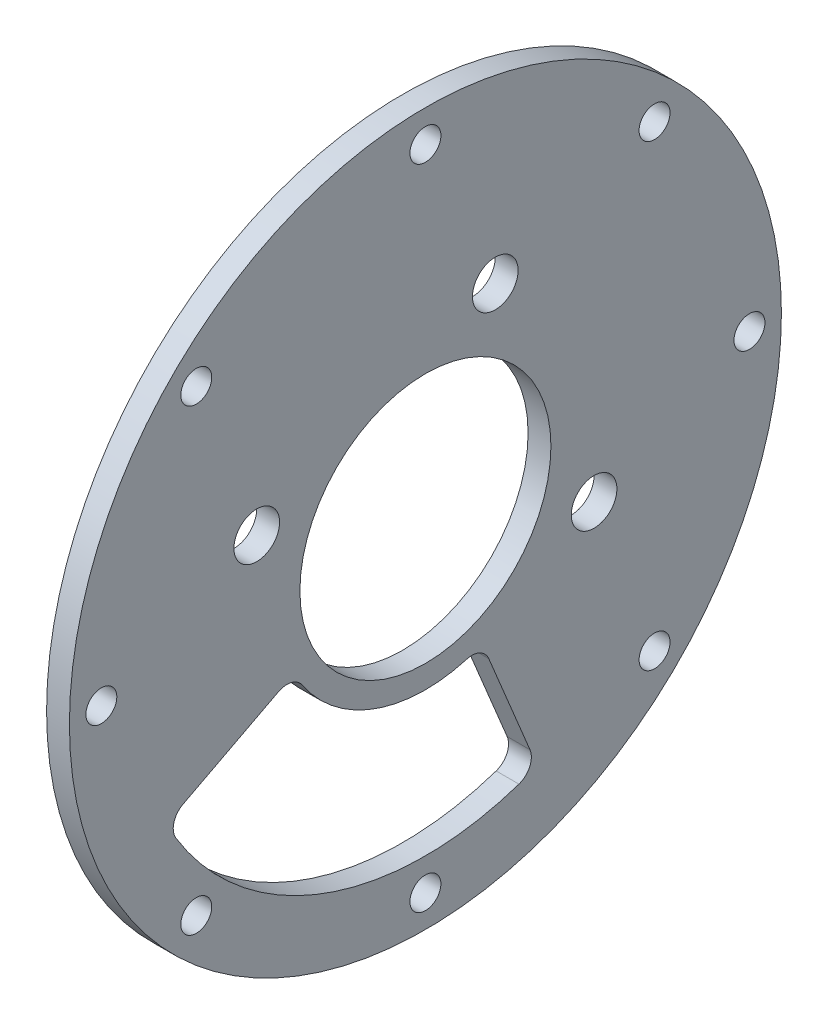
ISO-10303-21;
HEADER;
FILE_DESCRIPTION(('STEP AP214'),'2;1');
FILE_NAME('part.step','',(''),(''),'','','');
FILE_SCHEMA(('AUTOMOTIVE_DESIGN { 1 0 10303 214 1 1 1 1 }'));
ENDSEC;
DATA;
#1=APPLICATION_CONTEXT('core data for automotive mechanical design processes');
#2=APPLICATION_PROTOCOL_DEFINITION('international standard','automotive_design',2000,#1);
#3=PRODUCT_CONTEXT('',#1,'mechanical');
#4=PRODUCT('Part','Part','',(#3));
#5=PRODUCT_RELATED_PRODUCT_CATEGORY('part','',(#4));
#6=PRODUCT_DEFINITION_FORMATION('','',#4);
#7=PRODUCT_DEFINITION_CONTEXT('part definition',#1,'design');
#8=PRODUCT_DEFINITION('design','',#6,#7);
#9=PRODUCT_DEFINITION_SHAPE('','',#8);
#10=(LENGTH_UNIT() NAMED_UNIT(*) SI_UNIT(.MILLI.,.METRE.));
#11=(NAMED_UNIT(*) PLANE_ANGLE_UNIT() SI_UNIT($,.RADIAN.));
#12=(NAMED_UNIT(*) SI_UNIT($,.STERADIAN.) SOLID_ANGLE_UNIT());
#13=UNCERTAINTY_MEASURE_WITH_UNIT(LENGTH_MEASURE(1.E-05),#10,'distance_accuracy_value','');
#14=(GEOMETRIC_REPRESENTATION_CONTEXT(3) GLOBAL_UNCERTAINTY_ASSIGNED_CONTEXT((#13)) GLOBAL_UNIT_ASSIGNED_CONTEXT((#10,
#11,#12)) REPRESENTATION_CONTEXT('',''));
#15=CARTESIAN_POINT('',(0.,0.,0.));
#16=DIRECTION('',(0.,0.,1.));
#17=DIRECTION('',(1.,0.,0.));
#18=AXIS2_PLACEMENT_3D('',#15,#16,#17);
#19=CARTESIAN_POINT('',(3.175,0.,0.));
#20=DIRECTION('',(1.,0.,0.));
#21=DIRECTION('',(0.,0.,-1.));
#22=AXIS2_PLACEMENT_3D('',#19,#20,#21);
#23=PLANE('',#22);
#24=CARTESIAN_POINT('',(3.175,-36.0935171996778,-12.2011481491114));
#25=DIRECTION('',(1.,0.,0.));
#26=DIRECTION('',(0.,0.,1.));
#27=AXIS2_PLACEMENT_3D('',#24,#25,#26);
#28=CIRCLE('',#27,2.54);
#29=CARTESIAN_POINT('',(3.175,-38.4997516796563,-13.0145580257188));
#30=VERTEX_POINT('',#29);
#31=CARTESIAN_POINT('',(3.175,-35.1215012814704,-14.54780216169));
#32=VERTEX_POINT('',#31);
#33=EDGE_CURVE('E50',#30,#32,#28,.T.);
#34=ORIENTED_EDGE('',*,*,#33,.F.);
#35=CARTESIAN_POINT('',(3.175,0.,0.));
#36=DIRECTION('',(1.,0.,0.));
#37=DIRECTION('',(0.,0.,1.));
#38=AXIS2_PLACEMENT_3D('',#35,#36,#37);
#39=CIRCLE('',#38,40.64);
#40=CARTESIAN_POINT('',(3.175,-21.1269241911842,34.7168932109421));
#41=VERTEX_POINT('',#40);
#42=EDGE_CURVE('E119',#41,#30,#39,.T.);
#43=ORIENTED_EDGE('',*,*,#42,.F.);
#44=CARTESIAN_POINT('',(3.175,-19.8064914292351,32.5470873852582));
#45=DIRECTION('',(1.,0.,0.));
#46=DIRECTION('',(0.,0.,1.));
#47=AXIS2_PLACEMENT_3D('',#44,#45,#46);
#48=CIRCLE('',#47,2.54);
#49=CARTESIAN_POINT('',(3.175,-17.5534839129625,33.7199288628752));
#50=VERTEX_POINT('',#49);
#51=EDGE_CURVE('E122',#50,#41,#48,.T.);
#52=ORIENTED_EDGE('',*,*,#51,.F.);
#53=DIRECTION('',(0.,-0.461748613235051,0.887010833178213));
#54=VECTOR('',#53,1.);
#55=CARTESIAN_POINT('',(3.175,-10.6377190767493,20.4348682181746));
#56=LINE('',#55,#54);
#57=CARTESIAN_POINT('',(3.175,-10.6377190767493,20.4348682181746));
#58=VERTEX_POINT('',#57);
#59=EDGE_CURVE('E150',#58,#50,#56,.T.);
#60=ORIENTED_EDGE('',*,*,#59,.F.);
#61=CARTESIAN_POINT('',(3.175,-12.890726593022,19.2620267405576));
#62=DIRECTION('',(1.,0.,0.));
#63=DIRECTION('',(0.,0.,1.));
#64=AXIS2_PLACEMENT_3D('',#61,#62,#63);
#65=CIRCLE('',#64,2.54);
#66=CARTESIAN_POINT('',(3.175,-11.4780442266634,17.1511197004965));
#67=VERTEX_POINT('',#66);
#68=EDGE_CURVE('E147',#67,#58,#65,.T.);
#69=ORIENTED_EDGE('',*,*,#68,.F.);
#70=CARTESIAN_POINT('',(3.175,0.,0.));
#71=DIRECTION('',(-1.,0.,0.));
#72=DIRECTION('',(0.,0.,-1.));
#73=AXIS2_PLACEMENT_3D('',#70,#71,#72);
#74=CIRCLE('',#73,20.6375);
#75=CARTESIAN_POINT('',(3.175,-19.817219233439,-5.76057532750128));
#76=VERTEX_POINT('',#75);
#77=EDGE_CURVE('E144',#76,#67,#74,.T.);
#78=ORIENTED_EDGE('',*,*,#77,.F.);
#79=CARTESIAN_POINT('',(3.175,-22.2562616006315,-6.46956921396298));
#80=DIRECTION('',(1.,0.,0.));
#81=DIRECTION('',(0.,0.,1.));
#82=AXIS2_PLACEMENT_3D('',#79,#80,#81);
#83=CIRCLE('',#82,2.54);
#84=CARTESIAN_POINT('',(3.175,-21.2842456824241,-8.81622322654162));
#85=VERTEX_POINT('',#84);
#86=EDGE_CURVE('E141',#85,#76,#83,.T.);
#87=ORIENTED_EDGE('',*,*,#86,.F.);
#88=DIRECTION('',(0.,0.923879532511278,0.382683432365111));
#89=VECTOR('',#88,1.);
#90=CARTESIAN_POINT('',(3.175,-21.2842456824241,-8.81622322654162));
#91=LINE('',#90,#89);
#92=EDGE_CURVE('E139',#32,#85,#91,.T.);
#93=ORIENTED_EDGE('',*,*,#92,.F.);
#94=EDGE_LOOP('',(#34,#43,#52,#60,#69,#78,#87,#93));
#95=FACE_BOUND('',#94,.T.);
#96=CARTESIAN_POINT('',(3.175,23.4665401257866,-9.72015918207339));
#97=DIRECTION('',(1.,0.,0.));
#98=DIRECTION('',(0.,0.,-1.));
#99=AXIS2_PLACEMENT_3D('',#96,#97,#98);
#100=CIRCLE('',#99,3.175);
#101=CARTESIAN_POINT('',(3.175,23.4665401257866,-12.8951591820734));
#102=VERTEX_POINT('',#101);
#103=EDGE_CURVE('E181',#102,#102,#100,.T.);
#104=ORIENTED_EDGE('',*,*,#103,.F.);
#105=EDGE_LOOP('',(#104));
#106=FACE_BOUND('',#105,.T.);
#107=CARTESIAN_POINT('',(3.175,-6.5726235503307E-13,45.0849999999994));
#108=DIRECTION('',(1.,0.,0.));
#109=DIRECTION('',(0.,0.,-1.));
#110=AXIS2_PLACEMENT_3D('',#107,#108,#109);
#111=CIRCLE('',#110,2.15265);
#112=CARTESIAN_POINT('',(3.175,-6.5726235503307E-13,42.9323499999994));
#113=VERTEX_POINT('',#112);
#114=EDGE_CURVE('E193',#113,#113,#111,.T.);
#115=ORIENTED_EDGE('',*,*,#114,.F.);
#116=EDGE_LOOP('',(#115));
#117=FACE_BOUND('',#116,.T.);
#118=CARTESIAN_POINT('',(3.175,-45.085,-1.28329082477408E-12));
#119=DIRECTION('',(1.,0.,0.));
#120=DIRECTION('',(0.,0.,-1.));
#121=AXIS2_PLACEMENT_3D('',#118,#119,#120);
#122=CIRCLE('',#121,2.15265);
#123=CARTESIAN_POINT('',(3.175,-45.085,-2.15265000000128));
#124=VERTEX_POINT('',#123);
#125=EDGE_CURVE('E205',#124,#124,#122,.T.);
#126=ORIENTED_EDGE('',*,*,#125,.F.);
#127=EDGE_LOOP('',(#126));
#128=FACE_BOUND('',#127,.T.);
#129=CARTESIAN_POINT('',(3.175,-1.57413436161743E-13,-45.085));
#130=DIRECTION('',(1.,0.,0.));
#131=DIRECTION('',(0.,0.,-1.));
#132=AXIS2_PLACEMENT_3D('',#129,#130,#131);
#133=CIRCLE('',#132,2.15265);
#134=CARTESIAN_POINT('',(3.175,-1.57413436161743E-13,-47.23765));
#135=VERTEX_POINT('',#134);
#136=EDGE_CURVE('E217',#135,#135,#133,.T.);
#137=ORIENTED_EDGE('',*,*,#136,.F.);
#138=EDGE_LOOP('',(#137));
#139=FACE_BOUND('',#138,.T.);
#140=CARTESIAN_POINT('',(3.175,0.,0.));
#141=DIRECTION('',(1.,0.,0.));
#142=DIRECTION('',(0.,0.,-1.));
#143=AXIS2_PLACEMENT_3D('',#140,#141,#142);
#144=CIRCLE('',#143,17.4625);
#145=CARTESIAN_POINT('',(3.175,0.,-17.4625));
#146=VERTEX_POINT('',#145);
#147=EDGE_CURVE('E229',#146,#146,#144,.T.);
#148=ORIENTED_EDGE('',*,*,#147,.F.);
#149=EDGE_LOOP('',(#148));
#150=FACE_BOUND('',#149,.T.);
#151=CARTESIAN_POINT('',(3.175,0.,0.));
#152=DIRECTION('',(1.,0.,0.));
#153=DIRECTION('',(0.,0.,-1.));
#154=AXIS2_PLACEMENT_3D('',#151,#152,#153);
#155=CIRCLE('',#154,49.53);
#156=CARTESIAN_POINT('',(3.175,0.,-49.53));
#157=VERTEX_POINT('',#156);
#158=EDGE_CURVE('E11',#157,#157,#155,.T.);
#159=ORIENTED_EDGE('',*,*,#158,.T.);
#160=EDGE_LOOP('',(#159));
#161=FACE_BOUND('',#160,.T.);
#162=CARTESIAN_POINT('',(3.175,45.085,0.));
#163=DIRECTION('',(1.,0.,0.));
#164=DIRECTION('',(0.,0.,-1.));
#165=AXIS2_PLACEMENT_3D('',#162,#163,#164);
#166=CIRCLE('',#165,2.15265);
#167=CARTESIAN_POINT('',(3.175,45.085,-2.15265));
#168=VERTEX_POINT('',#167);
#169=EDGE_CURVE('E235',#168,#168,#166,.T.);
#170=ORIENTED_EDGE('',*,*,#169,.F.);
#171=EDGE_LOOP('',(#170));
#172=FACE_BOUND('',#171,.T.);
#173=CARTESIAN_POINT('',(3.175,31.8799092297954,-31.8799092297955));
#174=DIRECTION('',(1.,0.,0.));
#175=DIRECTION('',(0.,0.,-1.));
#176=AXIS2_PLACEMENT_3D('',#173,#174,#175);
#177=CIRCLE('',#176,2.15265);
#178=CARTESIAN_POINT('',(3.175,31.8799092297954,-34.0325592297955));
#179=VERTEX_POINT('',#178);
#180=EDGE_CURVE('E223',#179,#179,#177,.T.);
#181=ORIENTED_EDGE('',*,*,#180,.F.);
#182=EDGE_LOOP('',(#181));
#183=FACE_BOUND('',#182,.T.);
#184=CARTESIAN_POINT('',(3.175,-31.879909229795,-31.8799092297966));
#185=DIRECTION('',(1.,0.,0.));
#186=DIRECTION('',(0.,0.,-1.));
#187=AXIS2_PLACEMENT_3D('',#184,#185,#186);
#188=CIRCLE('',#187,2.15265);
#189=CARTESIAN_POINT('',(3.175,-31.879909229795,-34.0325592297966));
#190=VERTEX_POINT('',#189);
#191=EDGE_CURVE('E211',#190,#190,#188,.T.);
#192=ORIENTED_EDGE('',*,*,#191,.F.);
#193=EDGE_LOOP('',(#192));
#194=FACE_BOUND('',#193,.T.);
#195=CARTESIAN_POINT('',(3.175,-31.879909229796,31.8799092297944));
#196=DIRECTION('',(1.,0.,0.));
#197=DIRECTION('',(0.,0.,-1.));
#198=AXIS2_PLACEMENT_3D('',#195,#196,#197);
#199=CIRCLE('',#198,2.15265);
#200=CARTESIAN_POINT('',(3.175,-31.879909229796,29.7272592297944));
#201=VERTEX_POINT('',#200);
#202=EDGE_CURVE('E199',#201,#201,#199,.T.);
#203=ORIENTED_EDGE('',*,*,#202,.F.);
#204=EDGE_LOOP('',(#203));
#205=FACE_BOUND('',#204,.T.);
#206=CARTESIAN_POINT('',(3.175,31.8799092297959,31.8799092297951));
#207=DIRECTION('',(1.,0.,0.));
#208=DIRECTION('',(0.,0.,-1.));
#209=AXIS2_PLACEMENT_3D('',#206,#207,#208);
#210=CIRCLE('',#209,2.15265);
#211=CARTESIAN_POINT('',(3.175,31.8799092297959,29.7272592297951));
#212=VERTEX_POINT('',#211);
#213=EDGE_CURVE('E187',#212,#212,#210,.T.);
#214=ORIENTED_EDGE('',*,*,#213,.F.);
#215=EDGE_LOOP('',(#214));
#216=FACE_BOUND('',#215,.T.);
#217=CARTESIAN_POINT('',(3.175,-9.72015918207303,-23.466540125787));
#218=DIRECTION('',(1.,0.,0.));
#219=DIRECTION('',(0.,0.,-1.));
#220=AXIS2_PLACEMENT_3D('',#217,#218,#219);
#221=CIRCLE('',#220,3.175);
#222=CARTESIAN_POINT('',(3.175,-9.72015918207303,-26.641540125787));
#223=VERTEX_POINT('',#222);
#224=EDGE_CURVE('E175',#223,#223,#221,.T.);
#225=ORIENTED_EDGE('',*,*,#224,.F.);
#226=EDGE_LOOP('',(#225));
#227=FACE_BOUND('',#226,.T.);
#228=CARTESIAN_POINT('',(3.175,9.72015918207304,23.4665401257863));
#229=DIRECTION('',(1.,0.,0.));
#230=DIRECTION('',(0.,0.,-1.));
#231=AXIS2_PLACEMENT_3D('',#228,#229,#230);
#232=CIRCLE('',#231,3.175);
#233=CARTESIAN_POINT('',(3.175,9.72015918207304,20.2915401257863));
#234=VERTEX_POINT('',#233);
#235=EDGE_CURVE('E169',#234,#234,#232,.T.);
#236=ORIENTED_EDGE('',*,*,#235,.F.);
#237=EDGE_LOOP('',(#236));
#238=FACE_BOUND('',#237,.T.);
#239=ADVANCED_FACE('F35',(#95,#106,#117,#128,#139,#150,#161,#172,#183,#194,#205,#216,#227,#238),
#23,.T.);
#240=CARTESIAN_POINT('',(0.,0.,0.));
#241=DIRECTION('',(1.,0.,0.));
#242=DIRECTION('',(0.,0.,-1.));
#243=AXIS2_PLACEMENT_3D('',#240,#241,#242);
#244=PLANE('',#243);
#245=CARTESIAN_POINT('',(0.,0.,0.));
#246=DIRECTION('',(1.,0.,0.));
#247=DIRECTION('',(0.,0.,1.));
#248=AXIS2_PLACEMENT_3D('',#245,#246,#247);
#249=CIRCLE('',#248,40.64);
#250=CARTESIAN_POINT('',(0.,-21.1269241911842,34.7168932109421));
#251=VERTEX_POINT('',#250);
#252=CARTESIAN_POINT('',(0.,-38.4997516796563,-13.0145580257188));
#253=VERTEX_POINT('',#252);
#254=EDGE_CURVE('E108',#251,#253,#249,.T.);
#255=ORIENTED_EDGE('',*,*,#254,.T.);
#256=CARTESIAN_POINT('',(0.,-36.0935171996778,-12.2011481491114));
#257=DIRECTION('',(1.,0.,0.));
#258=DIRECTION('',(0.,0.,1.));
#259=AXIS2_PLACEMENT_3D('',#256,#257,#258);
#260=CIRCLE('',#259,2.54);
#261=CARTESIAN_POINT('',(0.,-35.1215012814704,-14.54780216169));
#262=VERTEX_POINT('',#261);
#263=EDGE_CURVE('E102',#253,#262,#260,.T.);
#264=ORIENTED_EDGE('',*,*,#263,.T.);
#265=DIRECTION('',(0.,0.923879532511278,0.382683432365111));
#266=VECTOR('',#265,1.);
#267=CARTESIAN_POINT('',(0.,-21.2842456824241,-8.81622322654162));
#268=LINE('',#267,#266);
#269=CARTESIAN_POINT('',(0.,-21.2842456824241,-8.81622322654162));
#270=VERTEX_POINT('',#269);
#271=EDGE_CURVE('E111',#262,#270,#268,.T.);
#272=ORIENTED_EDGE('',*,*,#271,.T.);
#273=CARTESIAN_POINT('',(0.,-22.2562616006315,-6.46956921396298));
#274=DIRECTION('',(1.,0.,0.));
#275=DIRECTION('',(0.,0.,1.));
#276=AXIS2_PLACEMENT_3D('',#273,#274,#275);
#277=CIRCLE('',#276,2.54);
#278=CARTESIAN_POINT('',(0.,-19.817219233439,-5.76057532750128));
#279=VERTEX_POINT('',#278);
#280=EDGE_CURVE('E58',#270,#279,#277,.T.);
#281=ORIENTED_EDGE('',*,*,#280,.T.);
#282=CARTESIAN_POINT('',(0.,0.,0.));
#283=DIRECTION('',(-1.,0.,0.));
#284=DIRECTION('',(0.,0.,-1.));
#285=AXIS2_PLACEMENT_3D('',#282,#283,#284);
#286=CIRCLE('',#285,20.6375);
#287=CARTESIAN_POINT('',(0.,-11.4780442266634,17.1511197004965));
#288=VERTEX_POINT('',#287);
#289=EDGE_CURVE('E126',#279,#288,#286,.T.);
#290=ORIENTED_EDGE('',*,*,#289,.T.);
#291=CARTESIAN_POINT('',(0.,-12.890726593022,19.2620267405576));
#292=DIRECTION('',(1.,0.,0.));
#293=DIRECTION('',(0.,0.,1.));
#294=AXIS2_PLACEMENT_3D('',#291,#292,#293);
#295=CIRCLE('',#294,2.54);
#296=CARTESIAN_POINT('',(0.,-10.6377190767493,20.4348682181746));
#297=VERTEX_POINT('',#296);
#298=EDGE_CURVE('E129',#288,#297,#295,.T.);
#299=ORIENTED_EDGE('',*,*,#298,.T.);
#300=DIRECTION('',(0.,-0.461748613235051,0.887010833178213));
#301=VECTOR('',#300,1.);
#302=CARTESIAN_POINT('',(0.,-10.6377190767493,20.4348682181746));
#303=LINE('',#302,#301);
#304=CARTESIAN_POINT('',(0.,-17.5534839129625,33.7199288628752));
#305=VERTEX_POINT('',#304);
#306=EDGE_CURVE('E132',#297,#305,#303,.T.);
#307=ORIENTED_EDGE('',*,*,#306,.T.);
#308=CARTESIAN_POINT('',(0.,-19.8064914292351,32.5470873852582));
#309=DIRECTION('',(1.,0.,0.));
#310=DIRECTION('',(0.,0.,1.));
#311=AXIS2_PLACEMENT_3D('',#308,#309,#310);
#312=CIRCLE('',#311,2.54);
#313=EDGE_CURVE('E135',#305,#251,#312,.T.);
#314=ORIENTED_EDGE('',*,*,#313,.T.);
#315=EDGE_LOOP('',(#255,#264,#272,#281,#290,#299,#307,#314));
#316=FACE_BOUND('',#315,.T.);
#317=CARTESIAN_POINT('',(0.,23.4665401257866,-9.72015918207339));
#318=DIRECTION('',(1.,0.,0.));
#319=DIRECTION('',(0.,0.,-1.));
#320=AXIS2_PLACEMENT_3D('',#317,#318,#319);
#321=CIRCLE('',#320,3.175);
#322=CARTESIAN_POINT('',(0.,23.4665401257866,-12.8951591820734));
#323=VERTEX_POINT('',#322);
#324=EDGE_CURVE('E178',#323,#323,#321,.T.);
#325=ORIENTED_EDGE('',*,*,#324,.T.);
#326=EDGE_LOOP('',(#325));
#327=FACE_BOUND('',#326,.T.);
#328=CARTESIAN_POINT('',(0.,-6.5726235503307E-13,45.0849999999994));
#329=DIRECTION('',(1.,0.,0.));
#330=DIRECTION('',(0.,0.,-1.));
#331=AXIS2_PLACEMENT_3D('',#328,#329,#330);
#332=CIRCLE('',#331,2.15265);
#333=CARTESIAN_POINT('',(0.,-6.5726235503307E-13,42.9323499999994));
#334=VERTEX_POINT('',#333);
#335=EDGE_CURVE('E190',#334,#334,#332,.T.);
#336=ORIENTED_EDGE('',*,*,#335,.T.);
#337=EDGE_LOOP('',(#336));
#338=FACE_BOUND('',#337,.T.);
#339=CARTESIAN_POINT('',(0.,-45.085,-1.28329082477408E-12));
#340=DIRECTION('',(1.,0.,0.));
#341=DIRECTION('',(0.,0.,-1.));
#342=AXIS2_PLACEMENT_3D('',#339,#340,#341);
#343=CIRCLE('',#342,2.15265);
#344=CARTESIAN_POINT('',(0.,-45.085,-2.15265000000128));
#345=VERTEX_POINT('',#344);
#346=EDGE_CURVE('E202',#345,#345,#343,.T.);
#347=ORIENTED_EDGE('',*,*,#346,.T.);
#348=EDGE_LOOP('',(#347));
#349=FACE_BOUND('',#348,.T.);
#350=CARTESIAN_POINT('',(0.,-1.57413436161743E-13,-45.085));
#351=DIRECTION('',(1.,0.,0.));
#352=DIRECTION('',(0.,0.,-1.));
#353=AXIS2_PLACEMENT_3D('',#350,#351,#352);
#354=CIRCLE('',#353,2.15265);
#355=CARTESIAN_POINT('',(0.,-1.57413436161743E-13,-47.23765));
#356=VERTEX_POINT('',#355);
#357=EDGE_CURVE('E214',#356,#356,#354,.T.);
#358=ORIENTED_EDGE('',*,*,#357,.T.);
#359=EDGE_LOOP('',(#358));
#360=FACE_BOUND('',#359,.T.);
#361=CARTESIAN_POINT('',(0.,0.,0.));
#362=DIRECTION('',(1.,0.,0.));
#363=DIRECTION('',(0.,0.,-1.));
#364=AXIS2_PLACEMENT_3D('',#361,#362,#363);
#365=CIRCLE('',#364,17.4625);
#366=CARTESIAN_POINT('',(0.,0.,-17.4625));
#367=VERTEX_POINT('',#366);
#368=EDGE_CURVE('E226',#367,#367,#365,.T.);
#369=ORIENTED_EDGE('',*,*,#368,.T.);
#370=EDGE_LOOP('',(#369));
#371=FACE_BOUND('',#370,.T.);
#372=CARTESIAN_POINT('',(0.,0.,0.));
#373=DIRECTION('',(1.,0.,0.));
#374=DIRECTION('',(0.,0.,-1.));
#375=AXIS2_PLACEMENT_3D('',#372,#373,#374);
#376=CIRCLE('',#375,49.53);
#377=CARTESIAN_POINT('',(0.,0.,-49.53));
#378=VERTEX_POINT('',#377);
#379=EDGE_CURVE('E39',#378,#378,#376,.T.);
#380=ORIENTED_EDGE('',*,*,#379,.F.);
#381=EDGE_LOOP('',(#380));
#382=FACE_BOUND('',#381,.T.);
#383=CARTESIAN_POINT('',(0.,45.085,0.));
#384=DIRECTION('',(1.,0.,0.));
#385=DIRECTION('',(0.,0.,-1.));
#386=AXIS2_PLACEMENT_3D('',#383,#384,#385);
#387=CIRCLE('',#386,2.15265);
#388=CARTESIAN_POINT('',(0.,45.085,-2.15265));
#389=VERTEX_POINT('',#388);
#390=EDGE_CURVE('E232',#389,#389,#387,.T.);
#391=ORIENTED_EDGE('',*,*,#390,.T.);
#392=EDGE_LOOP('',(#391));
#393=FACE_BOUND('',#392,.T.);
#394=CARTESIAN_POINT('',(0.,31.8799092297954,-31.8799092297955));
#395=DIRECTION('',(1.,0.,0.));
#396=DIRECTION('',(0.,0.,-1.));
#397=AXIS2_PLACEMENT_3D('',#394,#395,#396);
#398=CIRCLE('',#397,2.15265);
#399=CARTESIAN_POINT('',(0.,31.8799092297954,-34.0325592297955));
#400=VERTEX_POINT('',#399);
#401=EDGE_CURVE('E220',#400,#400,#398,.T.);
#402=ORIENTED_EDGE('',*,*,#401,.T.);
#403=EDGE_LOOP('',(#402));
#404=FACE_BOUND('',#403,.T.);
#405=CARTESIAN_POINT('',(0.,-31.879909229795,-31.8799092297966));
#406=DIRECTION('',(1.,0.,0.));
#407=DIRECTION('',(0.,0.,-1.));
#408=AXIS2_PLACEMENT_3D('',#405,#406,#407);
#409=CIRCLE('',#408,2.15265);
#410=CARTESIAN_POINT('',(0.,-31.879909229795,-34.0325592297966));
#411=VERTEX_POINT('',#410);
#412=EDGE_CURVE('E208',#411,#411,#409,.T.);
#413=ORIENTED_EDGE('',*,*,#412,.T.);
#414=EDGE_LOOP('',(#413));
#415=FACE_BOUND('',#414,.T.);
#416=CARTESIAN_POINT('',(0.,-31.879909229796,31.8799092297944));
#417=DIRECTION('',(1.,0.,0.));
#418=DIRECTION('',(0.,0.,-1.));
#419=AXIS2_PLACEMENT_3D('',#416,#417,#418);
#420=CIRCLE('',#419,2.15265);
#421=CARTESIAN_POINT('',(0.,-31.879909229796,29.7272592297944));
#422=VERTEX_POINT('',#421);
#423=EDGE_CURVE('E196',#422,#422,#420,.T.);
#424=ORIENTED_EDGE('',*,*,#423,.T.);
#425=EDGE_LOOP('',(#424));
#426=FACE_BOUND('',#425,.T.);
#427=CARTESIAN_POINT('',(0.,31.8799092297959,31.8799092297951));
#428=DIRECTION('',(1.,0.,0.));
#429=DIRECTION('',(0.,0.,-1.));
#430=AXIS2_PLACEMENT_3D('',#427,#428,#429);
#431=CIRCLE('',#430,2.15265);
#432=CARTESIAN_POINT('',(0.,31.8799092297959,29.7272592297951));
#433=VERTEX_POINT('',#432);
#434=EDGE_CURVE('E184',#433,#433,#431,.T.);
#435=ORIENTED_EDGE('',*,*,#434,.T.);
#436=EDGE_LOOP('',(#435));
#437=FACE_BOUND('',#436,.T.);
#438=CARTESIAN_POINT('',(0.,-9.72015918207303,-23.466540125787));
#439=DIRECTION('',(1.,0.,0.));
#440=DIRECTION('',(0.,0.,-1.));
#441=AXIS2_PLACEMENT_3D('',#438,#439,#440);
#442=CIRCLE('',#441,3.175);
#443=CARTESIAN_POINT('',(0.,-9.72015918207303,-26.641540125787));
#444=VERTEX_POINT('',#443);
#445=EDGE_CURVE('E172',#444,#444,#442,.T.);
#446=ORIENTED_EDGE('',*,*,#445,.T.);
#447=EDGE_LOOP('',(#446));
#448=FACE_BOUND('',#447,.T.);
#449=CARTESIAN_POINT('',(0.,9.72015918207304,23.4665401257863));
#450=DIRECTION('',(1.,0.,0.));
#451=DIRECTION('',(0.,0.,-1.));
#452=AXIS2_PLACEMENT_3D('',#449,#450,#451);
#453=CIRCLE('',#452,3.175);
#454=CARTESIAN_POINT('',(0.,9.72015918207304,20.2915401257863));
#455=VERTEX_POINT('',#454);
#456=EDGE_CURVE('E157',#455,#455,#453,.T.);
#457=ORIENTED_EDGE('',*,*,#456,.T.);
#458=EDGE_LOOP('',(#457));
#459=FACE_BOUND('',#458,.T.);
#460=ADVANCED_FACE('F115',(#316,#327,#338,#349,#360,#371,#382,#393,#404,#415,#426,#437,#448,
#459),#244,.F.);
#461=CARTESIAN_POINT('',(3.175,0.,0.));
#462=DIRECTION('',(-1.,0.,0.));
#463=DIRECTION('',(0.,0.,1.));
#464=AXIS2_PLACEMENT_3D('',#461,#462,#463);
#465=CYLINDRICAL_SURFACE('',#464,49.53);
#466=ORIENTED_EDGE('',*,*,#158,.F.);
#467=EDGE_LOOP('',(#466));
#468=FACE_BOUND('',#467,.T.);
#469=ORIENTED_EDGE('',*,*,#379,.T.);
#470=EDGE_LOOP('',(#469));
#471=FACE_BOUND('',#470,.T.);
#472=ADVANCED_FACE('F37',(#468,#471),#465,.T.);
#473=CARTESIAN_POINT('',(3.175,45.085,0.));
#474=DIRECTION('',(-1.,0.,0.));
#475=DIRECTION('',(0.,0.,1.));
#476=AXIS2_PLACEMENT_3D('',#473,#474,#475);
#477=CYLINDRICAL_SURFACE('',#476,2.15265);
#478=ORIENTED_EDGE('',*,*,#169,.T.);
#479=EDGE_LOOP('',(#478));
#480=FACE_BOUND('',#479,.T.);
#481=ORIENTED_EDGE('',*,*,#390,.F.);
#482=EDGE_LOOP('',(#481));
#483=FACE_BOUND('',#482,.T.);
#484=ADVANCED_FACE('F243',(#480,#483),#477,.F.);
#485=CARTESIAN_POINT('',(3.175,0.,0.));
#486=DIRECTION('',(-1.,0.,0.));
#487=DIRECTION('',(0.,0.,1.));
#488=AXIS2_PLACEMENT_3D('',#485,#486,#487);
#489=CYLINDRICAL_SURFACE('',#488,17.4625);
#490=ORIENTED_EDGE('',*,*,#147,.T.);
#491=EDGE_LOOP('',(#490));
#492=FACE_BOUND('',#491,.T.);
#493=ORIENTED_EDGE('',*,*,#368,.F.);
#494=EDGE_LOOP('',(#493));
#495=FACE_BOUND('',#494,.T.);
#496=ADVANCED_FACE('F245',(#492,#495),#489,.F.);
#497=CARTESIAN_POINT('',(3.175,31.8799092297954,-31.8799092297955));
#498=DIRECTION('',(-1.,0.,0.));
#499=DIRECTION('',(0.,0.,1.));
#500=AXIS2_PLACEMENT_3D('',#497,#498,#499);
#501=CYLINDRICAL_SURFACE('',#500,2.15265);
#502=ORIENTED_EDGE('',*,*,#180,.T.);
#503=EDGE_LOOP('',(#502));
#504=FACE_BOUND('',#503,.T.);
#505=ORIENTED_EDGE('',*,*,#401,.F.);
#506=EDGE_LOOP('',(#505));
#507=FACE_BOUND('',#506,.T.);
#508=ADVANCED_FACE('F252',(#504,#507),#501,.F.);
#509=CARTESIAN_POINT('',(3.175,-1.57413436161743E-13,-45.085));
#510=DIRECTION('',(-1.,0.,0.));
#511=DIRECTION('',(0.,0.,1.));
#512=AXIS2_PLACEMENT_3D('',#509,#510,#511);
#513=CYLINDRICAL_SURFACE('',#512,2.15265);
#514=ORIENTED_EDGE('',*,*,#136,.T.);
#515=EDGE_LOOP('',(#514));
#516=FACE_BOUND('',#515,.T.);
#517=ORIENTED_EDGE('',*,*,#357,.F.);
#518=EDGE_LOOP('',(#517));
#519=FACE_BOUND('',#518,.T.);
#520=ADVANCED_FACE('F330',(#516,#519),#513,.F.);
#521=CARTESIAN_POINT('',(3.175,-31.879909229795,-31.8799092297966));
#522=DIRECTION('',(-1.,0.,0.));
#523=DIRECTION('',(0.,0.,1.));
#524=AXIS2_PLACEMENT_3D('',#521,#522,#523);
#525=CYLINDRICAL_SURFACE('',#524,2.15265);
#526=ORIENTED_EDGE('',*,*,#191,.T.);
#527=EDGE_LOOP('',(#526));
#528=FACE_BOUND('',#527,.T.);
#529=ORIENTED_EDGE('',*,*,#412,.F.);
#530=EDGE_LOOP('',(#529));
#531=FACE_BOUND('',#530,.T.);
#532=ADVANCED_FACE('F326',(#528,#531),#525,.F.);
#533=CARTESIAN_POINT('',(3.175,-45.085,-1.28329082477408E-12));
#534=DIRECTION('',(-1.,0.,0.));
#535=DIRECTION('',(0.,0.,1.));
#536=AXIS2_PLACEMENT_3D('',#533,#534,#535);
#537=CYLINDRICAL_SURFACE('',#536,2.15265);
#538=ORIENTED_EDGE('',*,*,#125,.T.);
#539=EDGE_LOOP('',(#538));
#540=FACE_BOUND('',#539,.T.);
#541=ORIENTED_EDGE('',*,*,#346,.F.);
#542=EDGE_LOOP('',(#541));
#543=FACE_BOUND('',#542,.T.);
#544=ADVANCED_FACE('F322',(#540,#543),#537,.F.);
#545=CARTESIAN_POINT('',(3.175,-31.879909229796,31.8799092297944));
#546=DIRECTION('',(-1.,0.,0.));
#547=DIRECTION('',(0.,0.,1.));
#548=AXIS2_PLACEMENT_3D('',#545,#546,#547);
#549=CYLINDRICAL_SURFACE('',#548,2.15265);
#550=ORIENTED_EDGE('',*,*,#202,.T.);
#551=EDGE_LOOP('',(#550));
#552=FACE_BOUND('',#551,.T.);
#553=ORIENTED_EDGE('',*,*,#423,.F.);
#554=EDGE_LOOP('',(#553));
#555=FACE_BOUND('',#554,.T.);
#556=ADVANCED_FACE('F318',(#552,#555),#549,.F.);
#557=CARTESIAN_POINT('',(3.175,-6.5726235503307E-13,45.0849999999994));
#558=DIRECTION('',(-1.,0.,0.));
#559=DIRECTION('',(0.,0.,1.));
#560=AXIS2_PLACEMENT_3D('',#557,#558,#559);
#561=CYLINDRICAL_SURFACE('',#560,2.15265);
#562=ORIENTED_EDGE('',*,*,#114,.T.);
#563=EDGE_LOOP('',(#562));
#564=FACE_BOUND('',#563,.T.);
#565=ORIENTED_EDGE('',*,*,#335,.F.);
#566=EDGE_LOOP('',(#565));
#567=FACE_BOUND('',#566,.T.);
#568=ADVANCED_FACE('F314',(#564,#567),#561,.F.);
#569=CARTESIAN_POINT('',(3.175,31.8799092297959,31.8799092297951));
#570=DIRECTION('',(-1.,0.,0.));
#571=DIRECTION('',(0.,0.,1.));
#572=AXIS2_PLACEMENT_3D('',#569,#570,#571);
#573=CYLINDRICAL_SURFACE('',#572,2.15265);
#574=ORIENTED_EDGE('',*,*,#213,.T.);
#575=EDGE_LOOP('',(#574));
#576=FACE_BOUND('',#575,.T.);
#577=ORIENTED_EDGE('',*,*,#434,.F.);
#578=EDGE_LOOP('',(#577));
#579=FACE_BOUND('',#578,.T.);
#580=ADVANCED_FACE('F310',(#576,#579),#573,.F.);
#581=CARTESIAN_POINT('',(3.175,23.4665401257866,-9.72015918207339));
#582=DIRECTION('',(-1.,0.,0.));
#583=DIRECTION('',(0.,0.,1.));
#584=AXIS2_PLACEMENT_3D('',#581,#582,#583);
#585=CYLINDRICAL_SURFACE('',#584,3.175);
#586=ORIENTED_EDGE('',*,*,#103,.T.);
#587=EDGE_LOOP('',(#586));
#588=FACE_BOUND('',#587,.T.);
#589=ORIENTED_EDGE('',*,*,#324,.F.);
#590=EDGE_LOOP('',(#589));
#591=FACE_BOUND('',#590,.T.);
#592=ADVANCED_FACE('F303',(#588,#591),#585,.F.);
#593=CARTESIAN_POINT('',(3.175,-9.72015918207303,-23.466540125787));
#594=DIRECTION('',(-1.,0.,0.));
#595=DIRECTION('',(0.,0.,1.));
#596=AXIS2_PLACEMENT_3D('',#593,#594,#595);
#597=CYLINDRICAL_SURFACE('',#596,3.175);
#598=ORIENTED_EDGE('',*,*,#224,.T.);
#599=EDGE_LOOP('',(#598));
#600=FACE_BOUND('',#599,.T.);
#601=ORIENTED_EDGE('',*,*,#445,.F.);
#602=EDGE_LOOP('',(#601));
#603=FACE_BOUND('',#602,.T.);
#604=ADVANCED_FACE('F293',(#600,#603),#597,.F.);
#605=CARTESIAN_POINT('',(3.175,9.72015918207304,23.4665401257863));
#606=DIRECTION('',(-1.,0.,0.));
#607=DIRECTION('',(0.,0.,1.));
#608=AXIS2_PLACEMENT_3D('',#605,#606,#607);
#609=CYLINDRICAL_SURFACE('',#608,3.175);
#610=ORIENTED_EDGE('',*,*,#235,.T.);
#611=EDGE_LOOP('',(#610));
#612=FACE_BOUND('',#611,.T.);
#613=ORIENTED_EDGE('',*,*,#456,.F.);
#614=EDGE_LOOP('',(#613));
#615=FACE_BOUND('',#614,.T.);
#616=ADVANCED_FACE('F290',(#612,#615),#609,.F.);
#617=CARTESIAN_POINT('',(0.,-36.0935171996778,-12.2011481491114));
#618=DIRECTION('',(1.,0.,0.));
#619=DIRECTION('',(0.,0.,-1.));
#620=AXIS2_PLACEMENT_3D('',#617,#618,#619);
#621=CYLINDRICAL_SURFACE('',#620,2.54);
#622=ORIENTED_EDGE('',*,*,#33,.T.);
#623=DIRECTION('',(1.,0.,0.));
#624=VECTOR('',#623,1.);
#625=CARTESIAN_POINT('',(0.,-35.1215012814704,-14.54780216169));
#626=LINE('',#625,#624);
#627=EDGE_CURVE('E98',#262,#32,#626,.T.);
#628=ORIENTED_EDGE('',*,*,#627,.F.);
#629=ORIENTED_EDGE('',*,*,#263,.F.);
#630=DIRECTION('',(1.,0.,0.));
#631=VECTOR('',#630,1.);
#632=CARTESIAN_POINT('',(0.,-38.4997516796563,-13.0145580257188));
#633=LINE('',#632,#631);
#634=EDGE_CURVE('E155',#253,#30,#633,.T.);
#635=ORIENTED_EDGE('',*,*,#634,.T.);
#636=EDGE_LOOP('',(#622,#628,#629,#635));
#637=FACE_BOUND('',#636,.T.);
#638=ADVANCED_FACE('F100',(#637),#621,.F.);
#639=CARTESIAN_POINT('',(0.,0.,0.));
#640=DIRECTION('',(1.,0.,0.));
#641=DIRECTION('',(0.,0.,-1.));
#642=AXIS2_PLACEMENT_3D('',#639,#640,#641);
#643=CYLINDRICAL_SURFACE('',#642,40.64);
#644=ORIENTED_EDGE('',*,*,#42,.T.);
#645=ORIENTED_EDGE('',*,*,#634,.F.);
#646=ORIENTED_EDGE('',*,*,#254,.F.);
#647=DIRECTION('',(1.,0.,0.));
#648=VECTOR('',#647,1.);
#649=CARTESIAN_POINT('',(0.,-21.1269241911842,34.7168932109421));
#650=LINE('',#649,#648);
#651=EDGE_CURVE('E158',#251,#41,#650,.T.);
#652=ORIENTED_EDGE('',*,*,#651,.T.);
#653=EDGE_LOOP('',(#644,#645,#646,#652));
#654=FACE_BOUND('',#653,.T.);
#655=ADVANCED_FACE('F301',(#654),#643,.F.);
#656=CARTESIAN_POINT('',(0.,-19.8064914292351,32.5470873852582));
#657=DIRECTION('',(1.,0.,0.));
#658=DIRECTION('',(0.,0.,-1.));
#659=AXIS2_PLACEMENT_3D('',#656,#657,#658);
#660=CYLINDRICAL_SURFACE('',#659,2.54);
#661=ORIENTED_EDGE('',*,*,#51,.T.);
#662=ORIENTED_EDGE('',*,*,#651,.F.);
#663=ORIENTED_EDGE('',*,*,#313,.F.);
#664=DIRECTION('',(1.,0.,0.));
#665=VECTOR('',#664,1.);
#666=CARTESIAN_POINT('',(0.,-17.5534839129625,33.7199288628752));
#667=LINE('',#666,#665);
#668=EDGE_CURVE('E160',#305,#50,#667,.T.);
#669=ORIENTED_EDGE('',*,*,#668,.T.);
#670=EDGE_LOOP('',(#661,#662,#663,#669));
#671=FACE_BOUND('',#670,.T.);
#672=ADVANCED_FACE('F421',(#671),#660,.F.);
#673=CARTESIAN_POINT('',(0.,-10.6377190767493,20.4348682181746));
#674=DIRECTION('',(0.,0.887010833178213,0.461748613235051));
#675=DIRECTION('',(0.,-0.461748613235051,0.887010833178213));
#676=AXIS2_PLACEMENT_3D('',#673,#674,#675);
#677=PLANE('',#676);
#678=ORIENTED_EDGE('',*,*,#59,.T.);
#679=ORIENTED_EDGE('',*,*,#668,.F.);
#680=ORIENTED_EDGE('',*,*,#306,.F.);
#681=DIRECTION('',(1.,0.,0.));
#682=VECTOR('',#681,1.);
#683=CARTESIAN_POINT('',(0.,-10.6377190767493,20.4348682181746));
#684=LINE('',#683,#682);
#685=EDGE_CURVE('E162',#297,#58,#684,.T.);
#686=ORIENTED_EDGE('',*,*,#685,.T.);
#687=EDGE_LOOP('',(#678,#679,#680,#686));
#688=FACE_BOUND('',#687,.T.);
#689=ADVANCED_FACE('F431',(#688),#677,.F.);
#690=CARTESIAN_POINT('',(0.,-12.890726593022,19.2620267405576));
#691=DIRECTION('',(1.,0.,0.));
#692=DIRECTION('',(0.,0.,-1.));
#693=AXIS2_PLACEMENT_3D('',#690,#691,#692);
#694=CYLINDRICAL_SURFACE('',#693,2.54);
#695=ORIENTED_EDGE('',*,*,#68,.T.);
#696=ORIENTED_EDGE('',*,*,#685,.F.);
#697=ORIENTED_EDGE('',*,*,#298,.F.);
#698=DIRECTION('',(1.,0.,0.));
#699=VECTOR('',#698,1.);
#700=CARTESIAN_POINT('',(0.,-11.4780442266634,17.1511197004965));
#701=LINE('',#700,#699);
#702=EDGE_CURVE('E164',#288,#67,#701,.T.);
#703=ORIENTED_EDGE('',*,*,#702,.T.);
#704=EDGE_LOOP('',(#695,#696,#697,#703));
#705=FACE_BOUND('',#704,.T.);
#706=ADVANCED_FACE('F441',(#705),#694,.F.);
#707=CARTESIAN_POINT('',(0.,0.,0.));
#708=DIRECTION('',(1.,0.,0.));
#709=DIRECTION('',(0.,0.,-1.));
#710=AXIS2_PLACEMENT_3D('',#707,#708,#709);
#711=CYLINDRICAL_SURFACE('',#710,20.6375);
#712=ORIENTED_EDGE('',*,*,#77,.T.);
#713=ORIENTED_EDGE('',*,*,#702,.F.);
#714=ORIENTED_EDGE('',*,*,#289,.F.);
#715=DIRECTION('',(1.,0.,0.));
#716=VECTOR('',#715,1.);
#717=CARTESIAN_POINT('',(0.,-19.817219233439,-5.76057532750128));
#718=LINE('',#717,#716);
#719=EDGE_CURVE('E166',#279,#76,#718,.T.);
#720=ORIENTED_EDGE('',*,*,#719,.T.);
#721=EDGE_LOOP('',(#712,#713,#714,#720));
#722=FACE_BOUND('',#721,.T.);
#723=ADVANCED_FACE('F451',(#722),#711,.T.);
#724=CARTESIAN_POINT('',(0.,-22.2562616006315,-6.46956921396298));
#725=DIRECTION('',(1.,0.,0.));
#726=DIRECTION('',(0.,0.,-1.));
#727=AXIS2_PLACEMENT_3D('',#724,#725,#726);
#728=CYLINDRICAL_SURFACE('',#727,2.54);
#729=ORIENTED_EDGE('',*,*,#86,.T.);
#730=ORIENTED_EDGE('',*,*,#719,.F.);
#731=ORIENTED_EDGE('',*,*,#280,.F.);
#732=DIRECTION('',(1.,0.,0.));
#733=VECTOR('',#732,1.);
#734=CARTESIAN_POINT('',(0.,-21.2842456824241,-8.81622322654162));
#735=LINE('',#734,#733);
#736=EDGE_CURVE('E107',#270,#85,#735,.T.);
#737=ORIENTED_EDGE('',*,*,#736,.T.);
#738=EDGE_LOOP('',(#729,#730,#731,#737));
#739=FACE_BOUND('',#738,.T.);
#740=ADVANCED_FACE('F461',(#739),#728,.F.);
#741=CARTESIAN_POINT('',(0.,-21.2842456824241,-8.81622322654162));
#742=DIRECTION('',(0.,0.382683432365111,-0.923879532511278));
#743=DIRECTION('',(0.,0.923879532511278,0.382683432365111));
#744=AXIS2_PLACEMENT_3D('',#741,#742,#743);
#745=PLANE('',#744);
#746=ORIENTED_EDGE('',*,*,#92,.T.);
#747=ORIENTED_EDGE('',*,*,#736,.F.);
#748=ORIENTED_EDGE('',*,*,#271,.F.);
#749=ORIENTED_EDGE('',*,*,#627,.T.);
#750=EDGE_LOOP('',(#746,#747,#748,#749));
#751=FACE_BOUND('',#750,.T.);
#752=ADVANCED_FACE('F112',(#751),#745,.F.);
#753=CLOSED_SHELL('',(#239,#460,#472,#484,#496,#508,#520,#532,#544,#556,#568,#580,#592,#604,
#616,#638,#655,#672,#689,#706,#723,#740,#752));
#754=MANIFOLD_SOLID_BREP('B2',#753);
#755=ADVANCED_BREP_SHAPE_REPRESENTATION('',(#18,#754),#14);
#756=SHAPE_DEFINITION_REPRESENTATION(#9,#755);
ENDSEC;
END-ISO-10303-21;
